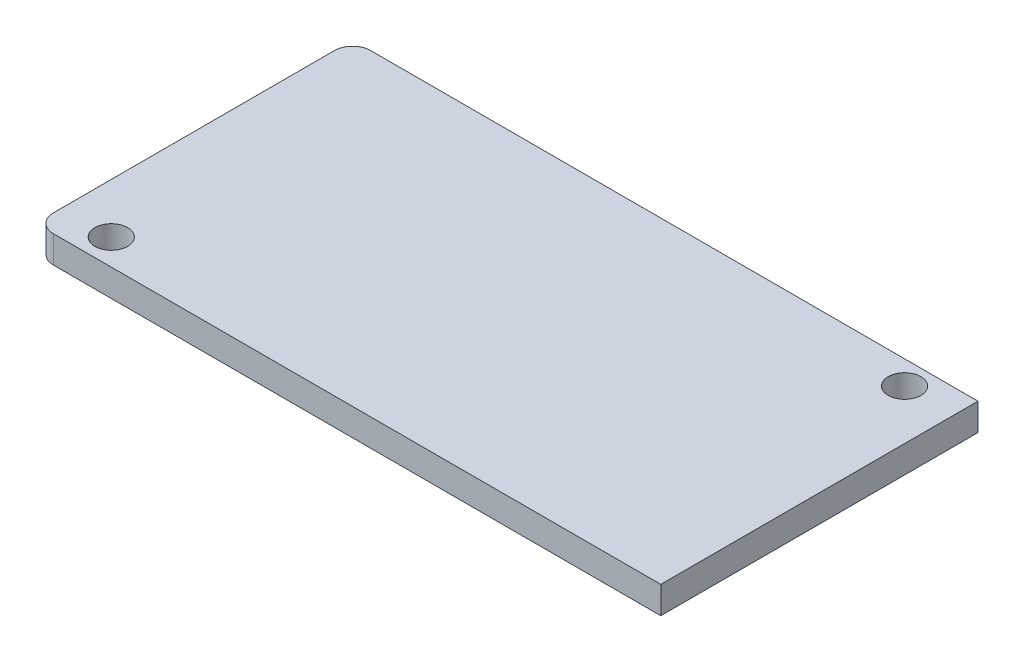
ISO-10303-21;
HEADER;
FILE_DESCRIPTION(('STEP AP214'),'2;1');
FILE_NAME('part.step','',(''),(''),'','','');
FILE_SCHEMA(('AUTOMOTIVE_DESIGN { 1 0 10303 214 1 1 1 1 }'));
ENDSEC;
DATA;
#1=APPLICATION_CONTEXT('core data for automotive mechanical design processes');
#2=APPLICATION_PROTOCOL_DEFINITION('international standard','automotive_design',2000,#1);
#3=PRODUCT_CONTEXT('',#1,'mechanical');
#4=PRODUCT('Part','Part','',(#3));
#5=PRODUCT_RELATED_PRODUCT_CATEGORY('part','',(#4));
#6=PRODUCT_DEFINITION_FORMATION('','',#4);
#7=PRODUCT_DEFINITION_CONTEXT('part definition',#1,'design');
#8=PRODUCT_DEFINITION('design','',#6,#7);
#9=PRODUCT_DEFINITION_SHAPE('','',#8);
#10=(LENGTH_UNIT() NAMED_UNIT(*) SI_UNIT(.MILLI.,.METRE.));
#11=(NAMED_UNIT(*) PLANE_ANGLE_UNIT() SI_UNIT($,.RADIAN.));
#12=(NAMED_UNIT(*) SI_UNIT($,.STERADIAN.) SOLID_ANGLE_UNIT());
#13=UNCERTAINTY_MEASURE_WITH_UNIT(LENGTH_MEASURE(1.E-05),#10,'distance_accuracy_value','');
#14=(GEOMETRIC_REPRESENTATION_CONTEXT(3) GLOBAL_UNCERTAINTY_ASSIGNED_CONTEXT((#13)) GLOBAL_UNIT_ASSIGNED_CONTEXT((#10,
#11,#12)) REPRESENTATION_CONTEXT('',''));
#15=CARTESIAN_POINT('',(0.,0.,0.));
#16=DIRECTION('',(0.,0.,1.));
#17=DIRECTION('',(1.,0.,0.));
#18=AXIS2_PLACEMENT_3D('',#15,#16,#17);
#19=CARTESIAN_POINT('',(34.5,3.,-17.5));
#20=DIRECTION('',(-1.,0.,0.));
#21=DIRECTION('',(0.,0.,1.));
#22=AXIS2_PLACEMENT_3D('',#19,#20,#21);
#23=PLANE('',#22);
#24=DIRECTION('',(0.,0.,-1.));
#25=VECTOR('',#24,1.);
#26=CARTESIAN_POINT('',(34.5,0.,-17.5));
#27=LINE('',#26,#25);
#28=CARTESIAN_POINT('',(34.5,0.,17.5));
#29=VERTEX_POINT('',#28);
#30=CARTESIAN_POINT('',(34.5,0.,-17.5));
#31=VERTEX_POINT('',#30);
#32=EDGE_CURVE('E106',#29,#31,#27,.T.);
#33=ORIENTED_EDGE('',*,*,#32,.T.);
#34=DIRECTION('',(0.,-1.,0.));
#35=VECTOR('',#34,1.);
#36=CARTESIAN_POINT('',(34.5,3.,-17.5));
#37=LINE('',#36,#35);
#38=CARTESIAN_POINT('',(34.5,3.,-17.5));
#39=VERTEX_POINT('',#38);
#40=EDGE_CURVE('E89',#39,#31,#37,.T.);
#41=ORIENTED_EDGE('',*,*,#40,.F.);
#42=DIRECTION('',(0.,0.,-1.));
#43=VECTOR('',#42,1.);
#44=CARTESIAN_POINT('',(34.5,3.,-17.5));
#45=LINE('',#44,#43);
#46=CARTESIAN_POINT('',(34.5,3.,17.5));
#47=VERTEX_POINT('',#46);
#48=EDGE_CURVE('E94',#47,#39,#45,.T.);
#49=ORIENTED_EDGE('',*,*,#48,.F.);
#50=DIRECTION('',(0.,-1.,0.));
#51=VECTOR('',#50,1.);
#52=CARTESIAN_POINT('',(34.5,3.,17.5));
#53=LINE('',#52,#51);
#54=EDGE_CURVE('E108',#47,#29,#53,.T.);
#55=ORIENTED_EDGE('',*,*,#54,.T.);
#56=EDGE_LOOP('',(#33,#41,#49,#55));
#57=FACE_BOUND('',#56,.T.);
#58=ADVANCED_FACE('F33',(#57),#23,.F.);
#59=CARTESIAN_POINT('',(-34.5,3.,-17.5));
#60=DIRECTION('',(0.,0.,1.));
#61=DIRECTION('',(1.,0.,0.));
#62=AXIS2_PLACEMENT_3D('',#59,#60,#61);
#63=PLANE('',#62);
#64=DIRECTION('',(-1.,0.,0.));
#65=VECTOR('',#64,1.);
#66=CARTESIAN_POINT('',(-34.5,0.,-17.5));
#67=LINE('',#66,#65);
#68=CARTESIAN_POINT('',(-32.5,0.,-17.5));
#69=VERTEX_POINT('',#68);
#70=EDGE_CURVE('E138',#31,#69,#67,.T.);
#71=ORIENTED_EDGE('',*,*,#70,.T.);
#72=DIRECTION('',(0.,-1.,0.));
#73=VECTOR('',#72,1.);
#74=CARTESIAN_POINT('',(-32.5,3.,-17.5));
#75=LINE('',#74,#73);
#76=CARTESIAN_POINT('',(-32.5,3.,-17.5));
#77=VERTEX_POINT('',#76);
#78=EDGE_CURVE('E11',#69,#77,#75,.F.);
#79=ORIENTED_EDGE('',*,*,#78,.T.);
#80=DIRECTION('',(-1.,0.,0.));
#81=VECTOR('',#80,1.);
#82=CARTESIAN_POINT('',(-34.5,3.,-17.5));
#83=LINE('',#82,#81);
#84=EDGE_CURVE('E85',#39,#77,#83,.T.);
#85=ORIENTED_EDGE('',*,*,#84,.F.);
#86=ORIENTED_EDGE('',*,*,#40,.T.);
#87=EDGE_LOOP('',(#71,#79,#85,#86));
#88=FACE_BOUND('',#87,.T.);
#89=ADVANCED_FACE('F87',(#88),#63,.F.);
#90=CARTESIAN_POINT('',(-34.5,3.,-17.5));
#91=DIRECTION('',(1.,0.,0.));
#92=DIRECTION('',(0.,0.,-1.));
#93=AXIS2_PLACEMENT_3D('',#90,#91,#92);
#94=PLANE('',#93);
#95=DIRECTION('',(0.,0.,1.));
#96=VECTOR('',#95,1.);
#97=CARTESIAN_POINT('',(-34.5,0.,-17.5));
#98=LINE('',#97,#96);
#99=CARTESIAN_POINT('',(-34.5,0.,-15.5));
#100=VERTEX_POINT('',#99);
#101=CARTESIAN_POINT('',(-34.5,0.,15.5));
#102=VERTEX_POINT('',#101);
#103=EDGE_CURVE('E135',#100,#102,#98,.T.);
#104=ORIENTED_EDGE('',*,*,#103,.T.);
#105=DIRECTION('',(0.,-1.,0.));
#106=VECTOR('',#105,1.);
#107=CARTESIAN_POINT('',(-34.5,3.,15.5));
#108=LINE('',#107,#106);
#109=CARTESIAN_POINT('',(-34.5,3.,15.5));
#110=VERTEX_POINT('',#109);
#111=EDGE_CURVE('E54',#102,#110,#108,.F.);
#112=ORIENTED_EDGE('',*,*,#111,.T.);
#113=DIRECTION('',(0.,0.,1.));
#114=VECTOR('',#113,1.);
#115=CARTESIAN_POINT('',(-34.5,3.,-17.5));
#116=LINE('',#115,#114);
#117=CARTESIAN_POINT('',(-34.5,3.,-15.5));
#118=VERTEX_POINT('',#117);
#119=EDGE_CURVE('E93',#118,#110,#116,.T.);
#120=ORIENTED_EDGE('',*,*,#119,.F.);
#121=DIRECTION('',(0.,-1.,0.));
#122=VECTOR('',#121,1.);
#123=CARTESIAN_POINT('',(-34.5,3.,-15.5));
#124=LINE('',#123,#122);
#125=EDGE_CURVE('E119',#118,#100,#124,.T.);
#126=ORIENTED_EDGE('',*,*,#125,.T.);
#127=EDGE_LOOP('',(#104,#112,#120,#126));
#128=FACE_BOUND('',#127,.T.);
#129=ADVANCED_FACE('F136',(#128),#94,.F.);
#130=CARTESIAN_POINT('',(-34.5,3.,17.5));
#131=DIRECTION('',(0.,0.,-1.));
#132=DIRECTION('',(-1.,0.,0.));
#133=AXIS2_PLACEMENT_3D('',#130,#131,#132);
#134=PLANE('',#133);
#135=DIRECTION('',(1.,0.,0.));
#136=VECTOR('',#135,1.);
#137=CARTESIAN_POINT('',(-34.5,3.,17.5));
#138=LINE('',#137,#136);
#139=CARTESIAN_POINT('',(-32.5,3.,17.5));
#140=VERTEX_POINT('',#139);
#141=EDGE_CURVE('E99',#140,#47,#138,.T.);
#142=ORIENTED_EDGE('',*,*,#141,.F.);
#143=DIRECTION('',(0.,-1.,0.));
#144=VECTOR('',#143,1.);
#145=CARTESIAN_POINT('',(-32.5,3.,17.5));
#146=LINE('',#145,#144);
#147=CARTESIAN_POINT('',(-32.5,0.,17.5));
#148=VERTEX_POINT('',#147);
#149=EDGE_CURVE('E107',#140,#148,#146,.T.);
#150=ORIENTED_EDGE('',*,*,#149,.T.);
#151=DIRECTION('',(1.,0.,0.));
#152=VECTOR('',#151,1.);
#153=CARTESIAN_POINT('',(-34.5,0.,17.5));
#154=LINE('',#153,#152);
#155=EDGE_CURVE('E103',#148,#29,#154,.T.);
#156=ORIENTED_EDGE('',*,*,#155,.T.);
#157=ORIENTED_EDGE('',*,*,#54,.F.);
#158=EDGE_LOOP('',(#142,#150,#156,#157));
#159=FACE_BOUND('',#158,.T.);
#160=ADVANCED_FACE('F128',(#159),#134,.F.);
#161=CARTESIAN_POINT('',(0.,3.,0.));
#162=DIRECTION('',(0.,1.,0.));
#163=DIRECTION('',(0.,0.,1.));
#164=AXIS2_PLACEMENT_3D('',#161,#162,#163);
#165=PLANE('',#164);
#166=CARTESIAN_POINT('',(-28.9999999999945,3.,14.6250000000132));
#167=DIRECTION('',(0.,1.,0.));
#168=DIRECTION('',(0.,0.,1.));
#169=AXIS2_PLACEMENT_3D('',#166,#167,#168);
#170=CIRCLE('',#169,1.8);
#171=CARTESIAN_POINT('',(-28.9999999999945,3.,12.8250000000131));
#172=VERTEX_POINT('',#171);
#173=EDGE_CURVE('E151',#172,#172,#170,.F.);
#174=ORIENTED_EDGE('',*,*,#173,.T.);
#175=EDGE_LOOP('',(#174));
#176=FACE_BOUND('',#175,.T.);
#177=CARTESIAN_POINT('',(29.0000000000051,3.,-14.8983278210894));
#178=DIRECTION('',(0.,1.,0.));
#179=DIRECTION('',(0.,0.,1.));
#180=AXIS2_PLACEMENT_3D('',#177,#178,#179);
#181=CIRCLE('',#180,1.79999999999993);
#182=CARTESIAN_POINT('',(29.0000000000051,3.,-16.6983278210893));
#183=VERTEX_POINT('',#182);
#184=EDGE_CURVE('E145',#183,#183,#181,.F.);
#185=ORIENTED_EDGE('',*,*,#184,.T.);
#186=EDGE_LOOP('',(#185));
#187=FACE_BOUND('',#186,.T.);
#188=ORIENTED_EDGE('',*,*,#119,.T.);
#189=CARTESIAN_POINT('',(-32.5,3.,15.5));
#190=DIRECTION('',(0.,1.,0.));
#191=DIRECTION('',(0.,0.,1.));
#192=AXIS2_PLACEMENT_3D('',#189,#190,#191);
#193=CIRCLE('',#192,2.);
#194=EDGE_CURVE('E41',#110,#140,#193,.T.);
#195=ORIENTED_EDGE('',*,*,#194,.T.);
#196=ORIENTED_EDGE('',*,*,#141,.T.);
#197=ORIENTED_EDGE('',*,*,#48,.T.);
#198=ORIENTED_EDGE('',*,*,#84,.T.);
#199=CARTESIAN_POINT('',(-32.5,3.,-15.5));
#200=DIRECTION('',(0.,1.,0.));
#201=DIRECTION('',(0.,0.,1.));
#202=AXIS2_PLACEMENT_3D('',#199,#200,#201);
#203=CIRCLE('',#202,2.);
#204=EDGE_CURVE('E123',#77,#118,#203,.T.);
#205=ORIENTED_EDGE('',*,*,#204,.T.);
#206=EDGE_LOOP('',(#188,#195,#196,#197,#198,#205));
#207=FACE_BOUND('',#206,.T.);
#208=ADVANCED_FACE('F97',(#176,#187,#207),#165,.T.);
#209=CARTESIAN_POINT('',(0.,0.,0.));
#210=DIRECTION('',(0.,1.,0.));
#211=DIRECTION('',(0.,0.,1.));
#212=AXIS2_PLACEMENT_3D('',#209,#210,#211);
#213=PLANE('',#212);
#214=CARTESIAN_POINT('',(-28.9999999999945,0.,14.6250000000132));
#215=DIRECTION('',(0.,-1.,0.));
#216=DIRECTION('',(0.,0.,-1.));
#217=AXIS2_PLACEMENT_3D('',#214,#215,#216);
#218=CIRCLE('',#217,1.8);
#219=CARTESIAN_POINT('',(-28.9999999999945,0.,12.8250000000131));
#220=VERTEX_POINT('',#219);
#221=EDGE_CURVE('E142',#220,#220,#218,.T.);
#222=ORIENTED_EDGE('',*,*,#221,.F.);
#223=EDGE_LOOP('',(#222));
#224=FACE_BOUND('',#223,.T.);
#225=CARTESIAN_POINT('',(29.0000000000051,0.,-14.8983278210894));
#226=DIRECTION('',(0.,-1.,0.));
#227=DIRECTION('',(0.,0.,-1.));
#228=AXIS2_PLACEMENT_3D('',#225,#226,#227);
#229=CIRCLE('',#228,1.79999999999993);
#230=CARTESIAN_POINT('',(29.0000000000051,0.,-16.6983278210893));
#231=VERTEX_POINT('',#230);
#232=EDGE_CURVE('E148',#231,#231,#229,.T.);
#233=ORIENTED_EDGE('',*,*,#232,.F.);
#234=EDGE_LOOP('',(#233));
#235=FACE_BOUND('',#234,.T.);
#236=ORIENTED_EDGE('',*,*,#155,.F.);
#237=CARTESIAN_POINT('',(-32.5,0.,15.5));
#238=DIRECTION('',(0.,1.,0.));
#239=DIRECTION('',(0.,0.,1.));
#240=AXIS2_PLACEMENT_3D('',#237,#238,#239);
#241=CIRCLE('',#240,2.);
#242=EDGE_CURVE('E117',#148,#102,#241,.F.);
#243=ORIENTED_EDGE('',*,*,#242,.T.);
#244=ORIENTED_EDGE('',*,*,#103,.F.);
#245=CARTESIAN_POINT('',(-32.5,0.,-15.5));
#246=DIRECTION('',(0.,1.,0.));
#247=DIRECTION('',(0.,0.,1.));
#248=AXIS2_PLACEMENT_3D('',#245,#246,#247);
#249=CIRCLE('',#248,2.);
#250=EDGE_CURVE('E111',#100,#69,#249,.F.);
#251=ORIENTED_EDGE('',*,*,#250,.T.);
#252=ORIENTED_EDGE('',*,*,#70,.F.);
#253=ORIENTED_EDGE('',*,*,#32,.F.);
#254=EDGE_LOOP('',(#236,#243,#244,#251,#252,#253));
#255=FACE_BOUND('',#254,.T.);
#256=ADVANCED_FACE('F134',(#224,#235,#255),#213,.F.);
#257=CARTESIAN_POINT('',(-32.5,3.,15.5));
#258=DIRECTION('',(0.,-1.,0.));
#259=DIRECTION('',(0.,0.,-1.));
#260=AXIS2_PLACEMENT_3D('',#257,#258,#259);
#261=CYLINDRICAL_SURFACE('',#260,2.);
#262=ORIENTED_EDGE('',*,*,#194,.F.);
#263=ORIENTED_EDGE('',*,*,#111,.F.);
#264=ORIENTED_EDGE('',*,*,#242,.F.);
#265=ORIENTED_EDGE('',*,*,#149,.F.);
#266=EDGE_LOOP('',(#262,#263,#264,#265));
#267=FACE_BOUND('',#266,.T.);
#268=ADVANCED_FACE('F131',(#267),#261,.T.);
#269=CARTESIAN_POINT('',(-32.5,3.,-15.5));
#270=DIRECTION('',(0.,-1.,0.));
#271=DIRECTION('',(0.,0.,-1.));
#272=AXIS2_PLACEMENT_3D('',#269,#270,#271);
#273=CYLINDRICAL_SURFACE('',#272,2.);
#274=ORIENTED_EDGE('',*,*,#204,.F.);
#275=ORIENTED_EDGE('',*,*,#78,.F.);
#276=ORIENTED_EDGE('',*,*,#250,.F.);
#277=ORIENTED_EDGE('',*,*,#125,.F.);
#278=EDGE_LOOP('',(#274,#275,#276,#277));
#279=FACE_BOUND('',#278,.T.);
#280=ADVANCED_FACE('F35',(#279),#273,.T.);
#281=CARTESIAN_POINT('',(29.0000000000051,3.001,-14.8983278210894));
#282=DIRECTION('',(0.,-1.,0.));
#283=DIRECTION('',(0.,0.,-1.));
#284=AXIS2_PLACEMENT_3D('',#281,#282,#283);
#285=CYLINDRICAL_SURFACE('',#284,1.79999999999993);
#286=CARTESIAN_POINT('',(29.0000000000051,3.,-16.6983278210893));
#287=CARTESIAN_POINT('',(29.0000000000051,2.96875,-16.6983278210893));
#288=CARTESIAN_POINT('',(29.0000000000051,2.9375,-16.6983278210893));
#289=CARTESIAN_POINT('',(29.0000000000051,2.875,-16.6983278210893));
#290=CARTESIAN_POINT('',(29.0000000000051,2.84375,-16.6983278210893));
#291=CARTESIAN_POINT('',(29.0000000000051,2.78125,-16.6983278210893));
#292=CARTESIAN_POINT('',(29.0000000000051,2.75,-16.6983278210893));
#293=CARTESIAN_POINT('',(29.0000000000051,2.6875,-16.6983278210893));
#294=CARTESIAN_POINT('',(29.0000000000051,2.65625,-16.6983278210893));
#295=CARTESIAN_POINT('',(29.0000000000051,2.59375,-16.6983278210893));
#296=CARTESIAN_POINT('',(29.0000000000051,2.5625,-16.6983278210893));
#297=CARTESIAN_POINT('',(29.0000000000051,2.5,-16.6983278210893));
#298=CARTESIAN_POINT('',(29.0000000000051,2.46875,-16.6983278210893));
#299=CARTESIAN_POINT('',(29.0000000000051,2.40625,-16.6983278210893));
#300=CARTESIAN_POINT('',(29.0000000000051,2.375,-16.6983278210893));
#301=CARTESIAN_POINT('',(29.0000000000051,2.3125,-16.6983278210893));
#302=CARTESIAN_POINT('',(29.0000000000051,2.28125,-16.6983278210893));
#303=CARTESIAN_POINT('',(29.0000000000051,2.21875,-16.6983278210893));
#304=CARTESIAN_POINT('',(29.0000000000051,2.1875,-16.6983278210893));
#305=CARTESIAN_POINT('',(29.0000000000051,2.125,-16.6983278210893));
#306=CARTESIAN_POINT('',(29.0000000000051,2.09375,-16.6983278210893));
#307=CARTESIAN_POINT('',(29.0000000000051,2.03125,-16.6983278210893));
#308=CARTESIAN_POINT('',(29.0000000000051,2.,-16.6983278210893));
#309=CARTESIAN_POINT('',(29.0000000000051,1.9375,-16.6983278210893));
#310=CARTESIAN_POINT('',(29.0000000000051,1.90625,-16.6983278210893));
#311=CARTESIAN_POINT('',(29.0000000000051,1.84375,-16.6983278210893));
#312=CARTESIAN_POINT('',(29.0000000000051,1.8125,-16.6983278210893));
#313=CARTESIAN_POINT('',(29.0000000000051,1.75,-16.6983278210893));
#314=CARTESIAN_POINT('',(29.0000000000051,1.71875,-16.6983278210893));
#315=CARTESIAN_POINT('',(29.0000000000051,1.65625,-16.6983278210893));
#316=CARTESIAN_POINT('',(29.0000000000051,1.625,-16.6983278210893));
#317=CARTESIAN_POINT('',(29.0000000000051,1.5625,-16.6983278210893));
#318=CARTESIAN_POINT('',(29.0000000000051,1.53125,-16.6983278210893));
#319=CARTESIAN_POINT('',(29.0000000000051,1.46875,-16.6983278210893));
#320=CARTESIAN_POINT('',(29.0000000000051,1.4375,-16.6983278210893));
#321=CARTESIAN_POINT('',(29.0000000000051,1.375,-16.6983278210893));
#322=CARTESIAN_POINT('',(29.0000000000051,1.34375,-16.6983278210893));
#323=CARTESIAN_POINT('',(29.0000000000051,1.28125,-16.6983278210893));
#324=CARTESIAN_POINT('',(29.0000000000051,1.25,-16.6983278210893));
#325=CARTESIAN_POINT('',(29.0000000000051,1.1875,-16.6983278210893));
#326=CARTESIAN_POINT('',(29.0000000000051,1.15625,-16.6983278210893));
#327=CARTESIAN_POINT('',(29.0000000000051,1.09375,-16.6983278210893));
#328=CARTESIAN_POINT('',(29.0000000000051,1.0625,-16.6983278210893));
#329=CARTESIAN_POINT('',(29.0000000000051,1.,-16.6983278210893));
#330=CARTESIAN_POINT('',(29.0000000000051,0.96875,-16.6983278210893));
#331=CARTESIAN_POINT('',(29.0000000000051,0.90625,-16.6983278210893));
#332=CARTESIAN_POINT('',(29.0000000000051,0.875,-16.6983278210893));
#333=CARTESIAN_POINT('',(29.0000000000051,0.8125,-16.6983278210893));
#334=CARTESIAN_POINT('',(29.0000000000051,0.78125,-16.6983278210893));
#335=CARTESIAN_POINT('',(29.0000000000051,0.71875,-16.6983278210893));
#336=CARTESIAN_POINT('',(29.0000000000051,0.6875,-16.6983278210893));
#337=CARTESIAN_POINT('',(29.0000000000051,0.625,-16.6983278210893));
#338=CARTESIAN_POINT('',(29.0000000000051,0.59375,-16.6983278210893));
#339=CARTESIAN_POINT('',(29.0000000000051,0.53125,-16.6983278210893));
#340=CARTESIAN_POINT('',(29.0000000000051,0.5,-16.6983278210893));
#341=CARTESIAN_POINT('',(29.0000000000051,0.4375,-16.6983278210893));
#342=CARTESIAN_POINT('',(29.0000000000051,0.40625,-16.6983278210893));
#343=CARTESIAN_POINT('',(29.0000000000051,0.34375,-16.6983278210893));
#344=CARTESIAN_POINT('',(29.0000000000051,0.3125,-16.6983278210893));
#345=CARTESIAN_POINT('',(29.0000000000051,0.25,-16.6983278210893));
#346=CARTESIAN_POINT('',(29.0000000000051,0.21875,-16.6983278210893));
#347=CARTESIAN_POINT('',(29.0000000000051,0.156250000000001,-16.6983278210893));
#348=CARTESIAN_POINT('',(29.0000000000051,0.125000000000001,-16.6983278210893));
#349=CARTESIAN_POINT('',(29.0000000000051,0.0625000000000005,-16.6983278210893));
#350=CARTESIAN_POINT('',(29.0000000000051,0.0312500000000005,-16.6983278210893));
#351=CARTESIAN_POINT('',(29.0000000000051,0.,-16.6983278210893));
#352=B_SPLINE_CURVE_WITH_KNOTS('',3,(#286,#287,#288,#289,#290,#291,#292,#293,#294,#295,#296,
#297,#298,#299,#300,#301,#302,#303,#304,#305,#306,#307,#308,#309,#310,#311,#312,#313,#314,#315,
#316,#317,#318,#319,#320,#321,#322,#323,#324,#325,#326,#327,#328,#329,#330,#331,#332,#333,#334,
#335,#336,#337,#338,#339,#340,#341,#342,#343,#344,#345,#346,#347,#348,#349,#350,#351),
.UNSPECIFIED.,.F.,.F.,(4,2,2,2,2,2,2,2,2,2,2,2,2,2,2,2,2,2,2,2,2,2,2,2,2,2,2,2,2,2,2,2,4),(0.,
0.0937499999999997,0.1875,0.28125,0.375,0.46875,0.5625,0.65625,0.749999999999999,
0.843749999999999,0.9375,1.03125,1.125,1.21875,1.3125,1.40625,1.5,1.59375,1.6875,1.78125,1.875,
1.96875,2.0625,2.15625,2.25,2.34375,2.4375,2.53125,2.625,2.71875,2.8125,2.90625,3.),.UNSPECIFIED.);
#353=EDGE_CURVE('BSEAM164',#183,#231,#352,.T.);
#354=ORIENTED_EDGE('',*,*,#184,.F.);
#355=ORIENTED_EDGE('',*,*,#232,.T.);
#356=ORIENTED_EDGE('',*,*,#353,.T.);
#357=ORIENTED_EDGE('',*,*,#353,.F.);
#358=EDGE_LOOP('',(#354,#356,#355,#357));
#359=FACE_BOUND('',#358,.T.);
#360=ADVANCED_FACE('F164',(#359),#285,.F.);
#361=CARTESIAN_POINT('',(-28.9999999999945,3.001,14.6250000000132));
#362=DIRECTION('',(0.,-1.,0.));
#363=DIRECTION('',(0.,0.,-1.));
#364=AXIS2_PLACEMENT_3D('',#361,#362,#363);
#365=CYLINDRICAL_SURFACE('',#364,1.8);
#366=CARTESIAN_POINT('',(-28.9999999999945,3.,12.8250000000131));
#367=CARTESIAN_POINT('',(-28.9999999999945,2.96875,12.8250000000131));
#368=CARTESIAN_POINT('',(-28.9999999999945,2.9375,12.8250000000131));
#369=CARTESIAN_POINT('',(-28.9999999999945,2.875,12.8250000000131));
#370=CARTESIAN_POINT('',(-28.9999999999945,2.84375,12.8250000000131));
#371=CARTESIAN_POINT('',(-28.9999999999945,2.78125,12.8250000000131));
#372=CARTESIAN_POINT('',(-28.9999999999945,2.75,12.8250000000131));
#373=CARTESIAN_POINT('',(-28.9999999999945,2.6875,12.8250000000131));
#374=CARTESIAN_POINT('',(-28.9999999999945,2.65625,12.8250000000131));
#375=CARTESIAN_POINT('',(-28.9999999999945,2.59375,12.8250000000131));
#376=CARTESIAN_POINT('',(-28.9999999999945,2.5625,12.8250000000131));
#377=CARTESIAN_POINT('',(-28.9999999999945,2.5,12.8250000000131));
#378=CARTESIAN_POINT('',(-28.9999999999945,2.46875,12.8250000000131));
#379=CARTESIAN_POINT('',(-28.9999999999945,2.40625,12.8250000000131));
#380=CARTESIAN_POINT('',(-28.9999999999945,2.375,12.8250000000131));
#381=CARTESIAN_POINT('',(-28.9999999999945,2.3125,12.8250000000131));
#382=CARTESIAN_POINT('',(-28.9999999999945,2.28125,12.8250000000131));
#383=CARTESIAN_POINT('',(-28.9999999999945,2.21875,12.8250000000131));
#384=CARTESIAN_POINT('',(-28.9999999999945,2.1875,12.8250000000131));
#385=CARTESIAN_POINT('',(-28.9999999999945,2.125,12.8250000000131));
#386=CARTESIAN_POINT('',(-28.9999999999945,2.09375,12.8250000000131));
#387=CARTESIAN_POINT('',(-28.9999999999945,2.03125,12.8250000000131));
#388=CARTESIAN_POINT('',(-28.9999999999945,2.,12.8250000000131));
#389=CARTESIAN_POINT('',(-28.9999999999945,1.9375,12.8250000000131));
#390=CARTESIAN_POINT('',(-28.9999999999945,1.90625,12.8250000000131));
#391=CARTESIAN_POINT('',(-28.9999999999945,1.84375,12.8250000000131));
#392=CARTESIAN_POINT('',(-28.9999999999945,1.8125,12.8250000000131));
#393=CARTESIAN_POINT('',(-28.9999999999945,1.75,12.8250000000131));
#394=CARTESIAN_POINT('',(-28.9999999999945,1.71875,12.8250000000131));
#395=CARTESIAN_POINT('',(-28.9999999999945,1.65625,12.8250000000131));
#396=CARTESIAN_POINT('',(-28.9999999999945,1.625,12.8250000000131));
#397=CARTESIAN_POINT('',(-28.9999999999945,1.5625,12.8250000000131));
#398=CARTESIAN_POINT('',(-28.9999999999945,1.53125,12.8250000000131));
#399=CARTESIAN_POINT('',(-28.9999999999945,1.46875,12.8250000000131));
#400=CARTESIAN_POINT('',(-28.9999999999945,1.4375,12.8250000000131));
#401=CARTESIAN_POINT('',(-28.9999999999945,1.375,12.8250000000131));
#402=CARTESIAN_POINT('',(-28.9999999999945,1.34375,12.8250000000131));
#403=CARTESIAN_POINT('',(-28.9999999999945,1.28125,12.8250000000131));
#404=CARTESIAN_POINT('',(-28.9999999999945,1.25,12.8250000000131));
#405=CARTESIAN_POINT('',(-28.9999999999945,1.1875,12.8250000000131));
#406=CARTESIAN_POINT('',(-28.9999999999945,1.15625,12.8250000000131));
#407=CARTESIAN_POINT('',(-28.9999999999945,1.09375,12.8250000000131));
#408=CARTESIAN_POINT('',(-28.9999999999945,1.0625,12.8250000000131));
#409=CARTESIAN_POINT('',(-28.9999999999945,1.,12.8250000000131));
#410=CARTESIAN_POINT('',(-28.9999999999945,0.96875,12.8250000000131));
#411=CARTESIAN_POINT('',(-28.9999999999945,0.90625,12.8250000000131));
#412=CARTESIAN_POINT('',(-28.9999999999945,0.875,12.8250000000131));
#413=CARTESIAN_POINT('',(-28.9999999999945,0.8125,12.8250000000131));
#414=CARTESIAN_POINT('',(-28.9999999999945,0.78125,12.8250000000131));
#415=CARTESIAN_POINT('',(-28.9999999999945,0.71875,12.8250000000131));
#416=CARTESIAN_POINT('',(-28.9999999999945,0.6875,12.8250000000131));
#417=CARTESIAN_POINT('',(-28.9999999999945,0.625,12.8250000000131));
#418=CARTESIAN_POINT('',(-28.9999999999945,0.59375,12.8250000000131));
#419=CARTESIAN_POINT('',(-28.9999999999945,0.53125,12.8250000000131));
#420=CARTESIAN_POINT('',(-28.9999999999945,0.5,12.8250000000131));
#421=CARTESIAN_POINT('',(-28.9999999999945,0.4375,12.8250000000131));
#422=CARTESIAN_POINT('',(-28.9999999999945,0.40625,12.8250000000131));
#423=CARTESIAN_POINT('',(-28.9999999999945,0.34375,12.8250000000131));
#424=CARTESIAN_POINT('',(-28.9999999999945,0.3125,12.8250000000131));
#425=CARTESIAN_POINT('',(-28.9999999999945,0.25,12.8250000000131));
#426=CARTESIAN_POINT('',(-28.9999999999945,0.21875,12.8250000000131));
#427=CARTESIAN_POINT('',(-28.9999999999945,0.156250000000001,12.8250000000131));
#428=CARTESIAN_POINT('',(-28.9999999999945,0.125000000000001,12.8250000000131));
#429=CARTESIAN_POINT('',(-28.9999999999945,0.0625000000000005,12.8250000000131));
#430=CARTESIAN_POINT('',(-28.9999999999945,0.0312500000000005,12.8250000000131));
#431=CARTESIAN_POINT('',(-28.9999999999945,0.,12.8250000000131));
#432=B_SPLINE_CURVE_WITH_KNOTS('',3,(#366,#367,#368,#369,#370,#371,#372,#373,#374,#375,#376,
#377,#378,#379,#380,#381,#382,#383,#384,#385,#386,#387,#388,#389,#390,#391,#392,#393,#394,#395,
#396,#397,#398,#399,#400,#401,#402,#403,#404,#405,#406,#407,#408,#409,#410,#411,#412,#413,#414,
#415,#416,#417,#418,#419,#420,#421,#422,#423,#424,#425,#426,#427,#428,#429,#430,#431),
.UNSPECIFIED.,.F.,.F.,(4,2,2,2,2,2,2,2,2,2,2,2,2,2,2,2,2,2,2,2,2,2,2,2,2,2,2,2,2,2,2,2,4),(0.,
0.0937499999999997,0.1875,0.28125,0.375,0.46875,0.5625,0.65625,0.749999999999999,
0.843749999999999,0.9375,1.03125,1.125,1.21875,1.3125,1.40625,1.5,1.59375,1.6875,1.78125,1.875,
1.96875,2.0625,2.15625,2.25,2.34375,2.4375,2.53125,2.625,2.71875,2.8125,2.90625,3.),.UNSPECIFIED.);
#433=EDGE_CURVE('BSEAM157',#172,#220,#432,.T.);
#434=ORIENTED_EDGE('',*,*,#173,.F.);
#435=ORIENTED_EDGE('',*,*,#221,.T.);
#436=ORIENTED_EDGE('',*,*,#433,.T.);
#437=ORIENTED_EDGE('',*,*,#433,.F.);
#438=EDGE_LOOP('',(#434,#436,#435,#437));
#439=FACE_BOUND('',#438,.T.);
#440=ADVANCED_FACE('F157',(#439),#365,.F.);
#441=CLOSED_SHELL('',(#58,#89,#129,#160,#208,#256,#268,#280,#360,#440));
#442=MANIFOLD_SOLID_BREP('B2',#441);
#443=ADVANCED_BREP_SHAPE_REPRESENTATION('',(#18,#442),#14);
#444=SHAPE_DEFINITION_REPRESENTATION(#9,#443);
ENDSEC;
END-ISO-10303-21;
